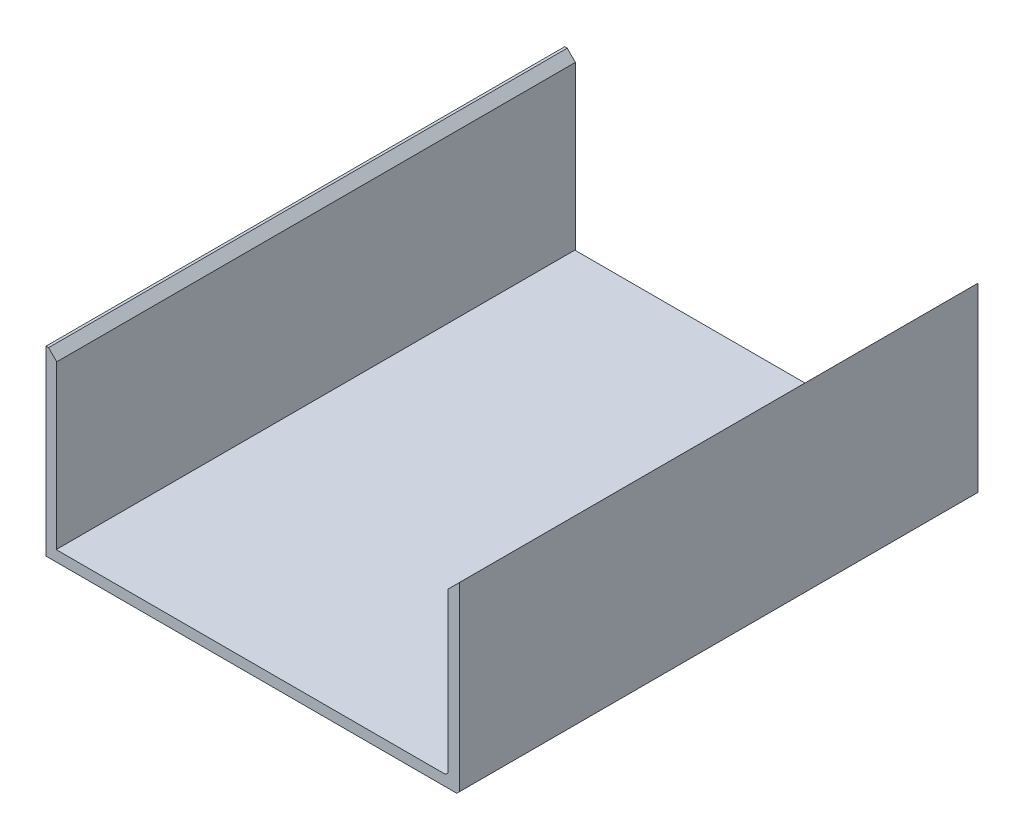
ISO-10303-21;
HEADER;
FILE_DESCRIPTION(('STEP AP214'),'2;1');
FILE_NAME('part.step','',(''),(''),'','','');
FILE_SCHEMA(('AUTOMOTIVE_DESIGN { 1 0 10303 214 1 1 1 1 }'));
ENDSEC;
DATA;
#1=APPLICATION_CONTEXT('core data for automotive mechanical design processes');
#2=APPLICATION_PROTOCOL_DEFINITION('international standard','automotive_design',2000,#1);
#3=PRODUCT_CONTEXT('',#1,'mechanical');
#4=PRODUCT('Part','Part','',(#3));
#5=PRODUCT_RELATED_PRODUCT_CATEGORY('part','',(#4));
#6=PRODUCT_DEFINITION_FORMATION('','',#4);
#7=PRODUCT_DEFINITION_CONTEXT('part definition',#1,'design');
#8=PRODUCT_DEFINITION('design','',#6,#7);
#9=PRODUCT_DEFINITION_SHAPE('','',#8);
#10=(LENGTH_UNIT() NAMED_UNIT(*) SI_UNIT(.MILLI.,.METRE.));
#11=(NAMED_UNIT(*) PLANE_ANGLE_UNIT() SI_UNIT($,.RADIAN.));
#12=(NAMED_UNIT(*) SI_UNIT($,.STERADIAN.) SOLID_ANGLE_UNIT());
#13=UNCERTAINTY_MEASURE_WITH_UNIT(LENGTH_MEASURE(1.E-05),#10,'distance_accuracy_value','');
#14=(GEOMETRIC_REPRESENTATION_CONTEXT(3) GLOBAL_UNCERTAINTY_ASSIGNED_CONTEXT((#13)) GLOBAL_UNIT_ASSIGNED_CONTEXT((#10,
#11,#12)) REPRESENTATION_CONTEXT('',''));
#15=CARTESIAN_POINT('',(0.,0.,0.));
#16=DIRECTION('',(0.,0.,1.));
#17=DIRECTION('',(1.,0.,0.));
#18=AXIS2_PLACEMENT_3D('',#15,#16,#17);
#19=CARTESIAN_POINT('',(-3.8958012,1.72306488,0.));
#20=DIRECTION('',(0.,-1.,0.));
#21=DIRECTION('',(0.,0.,-1.));
#22=AXIS2_PLACEMENT_3D('',#19,#20,#21);
#23=PLANE('',#22);
#24=DIRECTION('',(0.,0.,1.));
#25=VECTOR('',#24,1.);
#26=CARTESIAN_POINT('',(-3.94454888,1.72306488,0.));
#27=LINE('',#26,#25);
#28=CARTESIAN_POINT('',(-3.94454888,1.72306488,0.));
#29=VERTEX_POINT('',#28);
#30=CARTESIAN_POINT('',(-3.94454888,1.72306488,9.90000052));
#31=VERTEX_POINT('',#30);
#32=EDGE_CURVE('E123',#29,#31,#27,.T.);
#33=ORIENTED_EDGE('',*,*,#32,.T.);
#34=DIRECTION('',(1.,0.,0.));
#35=VECTOR('',#34,1.);
#36=CARTESIAN_POINT('',(-3.8958012,1.72306488,9.90000052));
#37=LINE('',#36,#35);
#38=CARTESIAN_POINT('',(-3.8958012,1.72306488,9.90000052));
#39=VERTEX_POINT('',#38);
#40=EDGE_CURVE('E108',#39,#31,#37,.F.);
#41=ORIENTED_EDGE('',*,*,#40,.F.);
#42=DIRECTION('',(0.,0.,1.));
#43=VECTOR('',#42,1.);
#44=CARTESIAN_POINT('',(-3.8958012,1.72306488,0.));
#45=LINE('',#44,#43);
#46=CARTESIAN_POINT('',(-3.8958012,1.72306488,0.));
#47=VERTEX_POINT('',#46);
#48=EDGE_CURVE('E194',#39,#47,#45,.F.);
#49=ORIENTED_EDGE('',*,*,#48,.T.);
#50=DIRECTION('',(1.,0.,0.));
#51=VECTOR('',#50,1.);
#52=CARTESIAN_POINT('',(-3.8958012,1.72306488,0.));
#53=LINE('',#52,#51);
#54=EDGE_CURVE('E120',#29,#47,#53,.T.);
#55=ORIENTED_EDGE('',*,*,#54,.F.);
#56=EDGE_LOOP('',(#33,#41,#49,#55));
#57=FACE_BOUND('',#56,.T.);
#58=ADVANCED_FACE('F17',(#57),#23,.F.);
#59=CARTESIAN_POINT('',(-3.73941848,1.56668216,0.));
#60=DIRECTION('',(-0.707106781186548,-0.707106781186548,0.));
#61=DIRECTION('',(0.707106781186548,-0.707106781186548,0.));
#62=AXIS2_PLACEMENT_3D('',#59,#60,#61);
#63=PLANE('',#62);
#64=ORIENTED_EDGE('',*,*,#48,.F.);
#65=DIRECTION('',(0.707106781186548,-0.707106781186548,0.));
#66=VECTOR('',#65,1.);
#67=CARTESIAN_POINT('',(-3.73941848,1.56668216,9.90000052));
#68=LINE('',#67,#66);
#69=CARTESIAN_POINT('',(-3.73941848,1.56668216,9.90000052));
#70=VERTEX_POINT('',#69);
#71=EDGE_CURVE('E116',#70,#39,#68,.F.);
#72=ORIENTED_EDGE('',*,*,#71,.F.);
#73=DIRECTION('',(0.,0.,1.));
#74=VECTOR('',#73,1.);
#75=CARTESIAN_POINT('',(-3.73941848,1.56668216,0.));
#76=LINE('',#75,#74);
#77=CARTESIAN_POINT('',(-3.73941848,1.56668216,0.));
#78=VERTEX_POINT('',#77);
#79=EDGE_CURVE('E166',#70,#78,#76,.F.);
#80=ORIENTED_EDGE('',*,*,#79,.T.);
#81=DIRECTION('',(0.707106781186548,-0.707106781186548,0.));
#82=VECTOR('',#81,1.);
#83=CARTESIAN_POINT('',(-3.73941848,1.56668216,0.));
#84=LINE('',#83,#82);
#85=EDGE_CURVE('E187',#47,#78,#84,.T.);
#86=ORIENTED_EDGE('',*,*,#85,.F.);
#87=EDGE_LOOP('',(#64,#72,#80,#86));
#88=FACE_BOUND('',#87,.T.);
#89=ADVANCED_FACE('F204',(#88),#63,.F.);
#90=CARTESIAN_POINT('',(-3.750691,-1.54263852,0.));
#91=DIRECTION('',(-0.707106781186048,0.707106781187048,0.));
#92=DIRECTION('',(-0.707106781187048,-0.707106781186048,0.));
#93=AXIS2_PLACEMENT_3D('',#90,#91,#92);
#94=PLANE('',#93);
#95=DIRECTION('',(0.,0.,1.));
#96=VECTOR('',#95,1.);
#97=CARTESIAN_POINT('',(-3.73941848,-1.531366,0.));
#98=LINE('',#97,#96);
#99=CARTESIAN_POINT('',(-3.73941848,-1.531366,0.));
#100=VERTEX_POINT('',#99);
#101=CARTESIAN_POINT('',(-3.73941848,-1.531366,9.90000052));
#102=VERTEX_POINT('',#101);
#103=EDGE_CURVE('E127',#100,#102,#98,.T.);
#104=ORIENTED_EDGE('',*,*,#103,.T.);
#105=DIRECTION('',(-0.707106781187048,-0.707106781186048,0.));
#106=VECTOR('',#105,1.);
#107=CARTESIAN_POINT('',(-3.750691,-1.54263852,9.90000052));
#108=LINE('',#107,#106);
#109=CARTESIAN_POINT('',(-3.750691,-1.54263852,9.90000052));
#110=VERTEX_POINT('',#109);
#111=EDGE_CURVE('E185',#110,#102,#108,.F.);
#112=ORIENTED_EDGE('',*,*,#111,.F.);
#113=DIRECTION('',(0.,0.,-1.));
#114=VECTOR('',#113,1.);
#115=CARTESIAN_POINT('',(-3.750691,-1.54263852,0.));
#116=LINE('',#115,#114);
#117=CARTESIAN_POINT('',(-3.750691,-1.54263852,0.));
#118=VERTEX_POINT('',#117);
#119=EDGE_CURVE('E160',#110,#118,#116,.T.);
#120=ORIENTED_EDGE('',*,*,#119,.T.);
#121=DIRECTION('',(-0.707106781187048,-0.707106781186048,0.));
#122=VECTOR('',#121,1.);
#123=CARTESIAN_POINT('',(-3.750691,-1.54263852,0.));
#124=LINE('',#123,#122);
#125=EDGE_CURVE('E183',#100,#118,#124,.T.);
#126=ORIENTED_EDGE('',*,*,#125,.F.);
#127=EDGE_LOOP('',(#104,#112,#120,#126));
#128=FACE_BOUND('',#127,.T.);
#129=ADVANCED_FACE('F372',(#128),#94,.F.);
#130=CARTESIAN_POINT('',(3.72744492,-1.49495764,0.));
#131=DIRECTION('',(0.707106781186548,-0.707106781186548,0.));
#132=DIRECTION('',(0.707106781186548,0.707106781186548,0.));
#133=AXIS2_PLACEMENT_3D('',#130,#131,#132);
#134=PLANE('',#133);
#135=DIRECTION('',(0.,0.,-1.));
#136=VECTOR('',#135,1.);
#137=CARTESIAN_POINT('',(3.67976404,-1.54263852,0.));
#138=LINE('',#137,#136);
#139=CARTESIAN_POINT('',(3.67976404,-1.54263852,0.));
#140=VERTEX_POINT('',#139);
#141=CARTESIAN_POINT('',(3.67976404,-1.54263852,9.90000052));
#142=VERTEX_POINT('',#141);
#143=EDGE_CURVE('E163',#140,#142,#138,.F.);
#144=ORIENTED_EDGE('',*,*,#143,.T.);
#145=DIRECTION('',(0.707106781186548,0.707106781186548,0.));
#146=VECTOR('',#145,1.);
#147=CARTESIAN_POINT('',(3.72744492,-1.49495764,9.90000052));
#148=LINE('',#147,#146);
#149=CARTESIAN_POINT('',(3.72744492,-1.49495764,9.90000052));
#150=VERTEX_POINT('',#149);
#151=EDGE_CURVE('E181',#150,#142,#148,.F.);
#152=ORIENTED_EDGE('',*,*,#151,.F.);
#153=DIRECTION('',(0.,0.,-1.));
#154=VECTOR('',#153,1.);
#155=CARTESIAN_POINT('',(3.72744492,-1.49495764,0.));
#156=LINE('',#155,#154);
#157=CARTESIAN_POINT('',(3.72744492,-1.49495764,0.));
#158=VERTEX_POINT('',#157);
#159=EDGE_CURVE('E154',#150,#158,#156,.T.);
#160=ORIENTED_EDGE('',*,*,#159,.T.);
#161=DIRECTION('',(0.707106781186548,0.707106781186548,0.));
#162=VECTOR('',#161,1.);
#163=CARTESIAN_POINT('',(3.72744492,-1.49495764,0.));
#164=LINE('',#163,#162);
#165=EDGE_CURVE('E179',#140,#158,#164,.T.);
#166=ORIENTED_EDGE('',*,*,#165,.F.);
#167=EDGE_LOOP('',(#144,#152,#160,#166));
#168=FACE_BOUND('',#167,.T.);
#169=ADVANCED_FACE('F245',(#168),#134,.F.);
#170=CARTESIAN_POINT('',(3.94458952,1.75979836,0.));
#171=DIRECTION('',(0.707106781186548,-0.707106781186548,0.));
#172=DIRECTION('',(0.707106781186548,0.707106781186548,0.));
#173=AXIS2_PLACEMENT_3D('',#170,#171,#172);
#174=PLANE('',#173);
#175=DIRECTION('',(0.,0.,-1.));
#176=VECTOR('',#175,1.);
#177=CARTESIAN_POINT('',(3.72744492,1.54265376,0.));
#178=LINE('',#177,#176);
#179=CARTESIAN_POINT('',(3.72744492,1.54265376,0.));
#180=VERTEX_POINT('',#179);
#181=CARTESIAN_POINT('',(3.72744492,1.54265376,9.90000052));
#182=VERTEX_POINT('',#181);
#183=EDGE_CURVE('E157',#180,#182,#178,.F.);
#184=ORIENTED_EDGE('',*,*,#183,.T.);
#185=DIRECTION('',(0.707106781186548,0.707106781186548,0.));
#186=VECTOR('',#185,1.);
#187=CARTESIAN_POINT('',(3.94458952,1.75979836,9.90000052));
#188=LINE('',#187,#186);
#189=CARTESIAN_POINT('',(3.94458952,1.75979836,9.90000052));
#190=VERTEX_POINT('',#189);
#191=EDGE_CURVE('E177',#190,#182,#188,.F.);
#192=ORIENTED_EDGE('',*,*,#191,.F.);
#193=DIRECTION('',(0.,0.,1.));
#194=VECTOR('',#193,1.);
#195=CARTESIAN_POINT('',(3.94458952,1.75979836,0.));
#196=LINE('',#195,#194);
#197=CARTESIAN_POINT('',(3.94458952,1.75979836,0.));
#198=VERTEX_POINT('',#197);
#199=EDGE_CURVE('E138',#190,#198,#196,.F.);
#200=ORIENTED_EDGE('',*,*,#199,.T.);
#201=DIRECTION('',(0.707106781186548,0.707106781186548,0.));
#202=VECTOR('',#201,1.);
#203=CARTESIAN_POINT('',(3.94458952,1.75979836,0.));
#204=LINE('',#203,#202);
#205=EDGE_CURVE('E128',#180,#198,#204,.T.);
#206=ORIENTED_EDGE('',*,*,#205,.F.);
#207=EDGE_LOOP('',(#184,#192,#200,#206));
#208=FACE_BOUND('',#207,.T.);
#209=ADVANCED_FACE('F356',(#208),#174,.F.);
#210=CARTESIAN_POINT('',(-3.94454888,1.72306488,0.));
#211=DIRECTION('',(0.999999989362867,0.000145857003157181,0.));
#212=DIRECTION('',(-0.000145857003157181,0.999999989362867,0.));
#213=AXIS2_PLACEMENT_3D('',#210,#211,#212);
#214=PLANE('',#213);
#215=DIRECTION('',(0.,0.,1.));
#216=VECTOR('',#215,1.);
#217=CARTESIAN_POINT('',(-3.9440408555521,-1.7599659755521,0.));
#218=LINE('',#217,#216);
#219=CARTESIAN_POINT('',(-3.94388783860097,-1.7596287917726,0.));
#220=VERTEX_POINT('',#219);
#221=CARTESIAN_POINT('',(-3.94388783860097,-1.7596287917726,9.90000052));
#222=VERTEX_POINT('',#221);
#223=EDGE_CURVE('E131',#220,#222,#218,.T.);
#224=ORIENTED_EDGE('',*,*,#223,.T.);
#225=DIRECTION('',(-0.000145857003030727,0.999999989362867,0.));
#226=VECTOR('',#225,1.);
#227=CARTESIAN_POINT('',(-3.944040926846,-1.759477185454,9.90000052));
#228=LINE('',#227,#226);
#229=EDGE_CURVE('E113',#222,#31,#228,.T.);
#230=ORIENTED_EDGE('',*,*,#229,.T.);
#231=ORIENTED_EDGE('',*,*,#32,.F.);
#232=DIRECTION('',(-0.000145857003030727,0.999999989362867,0.));
#233=VECTOR('',#232,1.);
#234=CARTESIAN_POINT('',(-3.944040926846,-1.759477185454,0.));
#235=LINE('',#234,#233);
#236=EDGE_CURVE('E211',#220,#29,#235,.T.);
#237=ORIENTED_EDGE('',*,*,#236,.F.);
#238=EDGE_LOOP('',(#224,#230,#231,#237));
#239=FACE_BOUND('',#238,.T.);
#240=ADVANCED_FACE('F130',(#239),#214,.F.);
#241=CARTESIAN_POINT('',(-3.73941848,-1.531366,0.));
#242=DIRECTION('',(-1.,0.,0.));
#243=DIRECTION('',(0.,0.,1.));
#244=AXIS2_PLACEMENT_3D('',#241,#242,#243);
#245=PLANE('',#244);
#246=ORIENTED_EDGE('',*,*,#79,.F.);
#247=DIRECTION('',(0.,1.,0.));
#248=VECTOR('',#247,1.);
#249=CARTESIAN_POINT('',(-3.73941848,1.75979836,9.90000052));
#250=LINE('',#249,#248);
#251=EDGE_CURVE('E133',#70,#102,#250,.F.);
#252=ORIENTED_EDGE('',*,*,#251,.T.);
#253=ORIENTED_EDGE('',*,*,#103,.F.);
#254=DIRECTION('',(0.,1.,0.));
#255=VECTOR('',#254,1.);
#256=CARTESIAN_POINT('',(-3.73941848,1.75979836,0.));
#257=LINE('',#256,#255);
#258=EDGE_CURVE('E209',#78,#100,#257,.F.);
#259=ORIENTED_EDGE('',*,*,#258,.F.);
#260=EDGE_LOOP('',(#246,#252,#253,#259));
#261=FACE_BOUND('',#260,.T.);
#262=ADVANCED_FACE('F340',(#261),#245,.F.);
#263=CARTESIAN_POINT('',(3.67976404,-1.54263852,0.));
#264=DIRECTION('',(0.,-1.,0.));
#265=DIRECTION('',(0.,0.,-1.));
#266=AXIS2_PLACEMENT_3D('',#263,#264,#265);
#267=PLANE('',#266);
#268=ORIENTED_EDGE('',*,*,#119,.F.);
#269=DIRECTION('',(-1.,0.,0.));
#270=VECTOR('',#269,1.);
#271=CARTESIAN_POINT('',(3.94458952,-1.54263852,9.90000052));
#272=LINE('',#271,#270);
#273=EDGE_CURVE('E136',#110,#142,#272,.F.);
#274=ORIENTED_EDGE('',*,*,#273,.T.);
#275=ORIENTED_EDGE('',*,*,#143,.F.);
#276=DIRECTION('',(-1.,0.,0.));
#277=VECTOR('',#276,1.);
#278=CARTESIAN_POINT('',(3.94458952,-1.54263852,0.));
#279=LINE('',#278,#277);
#280=EDGE_CURVE('E215',#118,#140,#279,.F.);
#281=ORIENTED_EDGE('',*,*,#280,.F.);
#282=EDGE_LOOP('',(#268,#274,#275,#281));
#283=FACE_BOUND('',#282,.T.);
#284=ADVANCED_FACE('F239',(#283),#267,.F.);
#285=CARTESIAN_POINT('',(3.72744492,1.54265376,0.));
#286=DIRECTION('',(1.,0.,0.));
#287=DIRECTION('',(0.,0.,-1.));
#288=AXIS2_PLACEMENT_3D('',#285,#286,#287);
#289=PLANE('',#288);
#290=ORIENTED_EDGE('',*,*,#159,.F.);
#291=DIRECTION('',(0.,1.,0.));
#292=VECTOR('',#291,1.);
#293=CARTESIAN_POINT('',(3.72744492,1.75979836,9.90000052));
#294=LINE('',#293,#292);
#295=EDGE_CURVE('E232',#150,#182,#294,.T.);
#296=ORIENTED_EDGE('',*,*,#295,.T.);
#297=ORIENTED_EDGE('',*,*,#183,.F.);
#298=DIRECTION('',(0.,1.,0.));
#299=VECTOR('',#298,1.);
#300=CARTESIAN_POINT('',(3.72744492,1.75979836,0.));
#301=LINE('',#300,#299);
#302=EDGE_CURVE('E248',#158,#180,#301,.T.);
#303=ORIENTED_EDGE('',*,*,#302,.F.);
#304=EDGE_LOOP('',(#290,#296,#297,#303));
#305=FACE_BOUND('',#304,.T.);
#306=ADVANCED_FACE('F277',(#305),#289,.F.);
#307=CARTESIAN_POINT('',(3.94458952,-1.6994632,0.));
#308=DIRECTION('',(-1.,0.,0.));
#309=DIRECTION('',(0.,0.,1.));
#310=AXIS2_PLACEMENT_3D('',#307,#308,#309);
#311=PLANE('',#310);
#312=ORIENTED_EDGE('',*,*,#199,.F.);
#313=DIRECTION('',(0.,1.,0.));
#314=VECTOR('',#313,1.);
#315=CARTESIAN_POINT('',(3.94458952,1.75979836,9.90000052));
#316=LINE('',#315,#314);
#317=CARTESIAN_POINT('',(3.94458952,-1.6994632,9.90000052));
#318=VERTEX_POINT('',#317);
#319=EDGE_CURVE('E228',#190,#318,#316,.F.);
#320=ORIENTED_EDGE('',*,*,#319,.T.);
#321=DIRECTION('',(0.,0.,1.));
#322=VECTOR('',#321,1.);
#323=CARTESIAN_POINT('',(3.94458952,-1.6994632,0.));
#324=LINE('',#323,#322);
#325=CARTESIAN_POINT('',(3.94458952,-1.6994632,0.));
#326=VERTEX_POINT('',#325);
#327=EDGE_CURVE('E213',#318,#326,#324,.F.);
#328=ORIENTED_EDGE('',*,*,#327,.T.);
#329=DIRECTION('',(0.,1.,0.));
#330=VECTOR('',#329,1.);
#331=CARTESIAN_POINT('',(3.94458952,1.75979836,0.));
#332=LINE('',#331,#330);
#333=EDGE_CURVE('E249',#198,#326,#332,.F.);
#334=ORIENTED_EDGE('',*,*,#333,.F.);
#335=EDGE_LOOP('',(#312,#320,#328,#334));
#336=FACE_BOUND('',#335,.T.);
#337=ADVANCED_FACE('F269',(#336),#311,.F.);
#338=CARTESIAN_POINT('',(-3.94368274,-1.75960786,0.));
#339=DIRECTION('',(-0.707106781187048,0.707106781186048,0.));
#340=DIRECTION('',(-0.707106781186048,-0.707106781187048,0.));
#341=AXIS2_PLACEMENT_3D('',#338,#339,#340);
#342=PLANE('',#341);
#343=DIRECTION('',(0.,0.,1.));
#344=VECTOR('',#343,1.);
#345=CARTESIAN_POINT('',(-3.9318438,-1.74776892,0.));
#346=LINE('',#345,#344);
#347=CARTESIAN_POINT('',(-3.9318438,-1.74776892,0.));
#348=VERTEX_POINT('',#347);
#349=CARTESIAN_POINT('',(-3.9318438,-1.74776892,9.90000052));
#350=VERTEX_POINT('',#349);
#351=EDGE_CURVE('E143',#348,#350,#346,.T.);
#352=ORIENTED_EDGE('',*,*,#351,.T.);
#353=DIRECTION('',(-0.707106781186496,-0.707106781186599,0.));
#354=VECTOR('',#353,1.);
#355=CARTESIAN_POINT('',(-3.9318438,-1.74776892,9.90000052));
#356=LINE('',#355,#354);
#357=EDGE_CURVE('E226',#350,#222,#356,.T.);
#358=ORIENTED_EDGE('',*,*,#357,.T.);
#359=ORIENTED_EDGE('',*,*,#223,.F.);
#360=DIRECTION('',(-0.707106781186496,-0.707106781186599,0.));
#361=VECTOR('',#360,1.);
#362=CARTESIAN_POINT('',(-3.9318438,-1.74776892,0.));
#363=LINE('',#362,#361);
#364=EDGE_CURVE('E147',#348,#220,#363,.T.);
#365=ORIENTED_EDGE('',*,*,#364,.F.);
#366=EDGE_LOOP('',(#352,#358,#359,#365));
#367=FACE_BOUND('',#366,.T.);
#368=ADVANCED_FACE('F267',(#367),#342,.F.);
#369=CARTESIAN_POINT('',(3.94458952,1.75979836,9.90000052));
#370=DIRECTION('',(0.,0.,-1.));
#371=DIRECTION('',(-1.,0.,0.));
#372=AXIS2_PLACEMENT_3D('',#369,#370,#371);
#373=PLANE('',#372);
#374=DIRECTION('',(1.,0.,0.));
#375=VECTOR('',#374,1.);
#376=CARTESIAN_POINT('',(-3.9318438,-1.74776892,9.90000052));
#377=LINE('',#376,#375);
#378=CARTESIAN_POINT('',(3.8962838,-1.74776892,9.90000052));
#379=VERTEX_POINT('',#378);
#380=EDGE_CURVE('E146',#350,#379,#377,.T.);
#381=ORIENTED_EDGE('',*,*,#380,.T.);
#382=DIRECTION('',(-0.707106781186548,-0.707106781186548,0.));
#383=VECTOR('',#382,1.);
#384=CARTESIAN_POINT('',(3.8962838,-1.74776892,9.90000052));
#385=LINE('',#384,#383);
#386=EDGE_CURVE('E218',#379,#318,#385,.F.);
#387=ORIENTED_EDGE('',*,*,#386,.T.);
#388=ORIENTED_EDGE('',*,*,#319,.F.);
#389=ORIENTED_EDGE('',*,*,#191,.T.);
#390=ORIENTED_EDGE('',*,*,#295,.F.);
#391=ORIENTED_EDGE('',*,*,#151,.T.);
#392=ORIENTED_EDGE('',*,*,#273,.F.);
#393=ORIENTED_EDGE('',*,*,#111,.T.);
#394=ORIENTED_EDGE('',*,*,#251,.F.);
#395=ORIENTED_EDGE('',*,*,#71,.T.);
#396=ORIENTED_EDGE('',*,*,#40,.T.);
#397=ORIENTED_EDGE('',*,*,#229,.F.);
#398=ORIENTED_EDGE('',*,*,#357,.F.);
#399=EDGE_LOOP('',(#381,#387,#388,#389,#390,#391,#392,#393,#394,#395,#396,#397,#398));
#400=FACE_BOUND('',#399,.T.);
#401=ADVANCED_FACE('F111',(#400),#373,.F.);
#402=CARTESIAN_POINT('',(3.8962838,-1.74776892,0.));
#403=DIRECTION('',(-0.707106781186548,0.707106781186548,0.));
#404=DIRECTION('',(-0.707106781186548,-0.707106781186548,0.));
#405=AXIS2_PLACEMENT_3D('',#402,#403,#404);
#406=PLANE('',#405);
#407=ORIENTED_EDGE('',*,*,#327,.F.);
#408=ORIENTED_EDGE('',*,*,#386,.F.);
#409=DIRECTION('',(0.,0.,1.));
#410=VECTOR('',#409,1.);
#411=CARTESIAN_POINT('',(3.8962838,-1.74776892,0.));
#412=LINE('',#411,#410);
#413=CARTESIAN_POINT('',(3.8962838,-1.74776892,0.));
#414=VERTEX_POINT('',#413);
#415=EDGE_CURVE('E26',#379,#414,#412,.F.);
#416=ORIENTED_EDGE('',*,*,#415,.T.);
#417=DIRECTION('',(-0.707106781186544,-0.707106781186551,0.));
#418=VECTOR('',#417,1.);
#419=CARTESIAN_POINT('',(3.94458952,-1.6994632,0.));
#420=LINE('',#419,#418);
#421=EDGE_CURVE('E34',#326,#414,#420,.T.);
#422=ORIENTED_EDGE('',*,*,#421,.F.);
#423=EDGE_LOOP('',(#407,#408,#416,#422));
#424=FACE_BOUND('',#423,.T.);
#425=ADVANCED_FACE('F261',(#424),#406,.F.);
#426=CARTESIAN_POINT('',(3.94458952,1.75979836,0.));
#427=DIRECTION('',(0.,0.,-1.));
#428=DIRECTION('',(-1.,0.,0.));
#429=AXIS2_PLACEMENT_3D('',#426,#427,#428);
#430=PLANE('',#429);
#431=DIRECTION('',(1.,0.,0.));
#432=VECTOR('',#431,1.);
#433=CARTESIAN_POINT('',(-3.9318438,-1.74776892,0.));
#434=LINE('',#433,#432);
#435=EDGE_CURVE('E11',#414,#348,#434,.F.);
#436=ORIENTED_EDGE('',*,*,#435,.T.);
#437=ORIENTED_EDGE('',*,*,#364,.T.);
#438=ORIENTED_EDGE('',*,*,#236,.T.);
#439=ORIENTED_EDGE('',*,*,#54,.T.);
#440=ORIENTED_EDGE('',*,*,#85,.T.);
#441=ORIENTED_EDGE('',*,*,#258,.T.);
#442=ORIENTED_EDGE('',*,*,#125,.T.);
#443=ORIENTED_EDGE('',*,*,#280,.T.);
#444=ORIENTED_EDGE('',*,*,#165,.T.);
#445=ORIENTED_EDGE('',*,*,#302,.T.);
#446=ORIENTED_EDGE('',*,*,#205,.T.);
#447=ORIENTED_EDGE('',*,*,#333,.T.);
#448=ORIENTED_EDGE('',*,*,#421,.T.);
#449=EDGE_LOOP('',(#436,#437,#438,#439,#440,#441,#442,#443,#444,#445,#446,#447,#448));
#450=FACE_BOUND('',#449,.T.);
#451=ADVANCED_FACE('F208',(#450),#430,.T.);
#452=CARTESIAN_POINT('',(-3.9318438,-1.74776892,0.));
#453=DIRECTION('',(0.,1.,0.));
#454=DIRECTION('',(0.,0.,1.));
#455=AXIS2_PLACEMENT_3D('',#452,#453,#454);
#456=PLANE('',#455);
#457=ORIENTED_EDGE('',*,*,#415,.F.);
#458=ORIENTED_EDGE('',*,*,#380,.F.);
#459=ORIENTED_EDGE('',*,*,#351,.F.);
#460=ORIENTED_EDGE('',*,*,#435,.F.);
#461=EDGE_LOOP('',(#457,#458,#459,#460));
#462=FACE_BOUND('',#461,.T.);
#463=ADVANCED_FACE('F264',(#462),#456,.F.);
#464=CLOSED_SHELL('',(#58,#89,#129,#169,#209,#240,#262,#284,#306,#337,#368,#401,#425,#451,#463));
#465=MANIFOLD_SOLID_BREP('B1',#464);
#466=ADVANCED_BREP_SHAPE_REPRESENTATION('',(#18,#465),#14);
#467=SHAPE_DEFINITION_REPRESENTATION(#9,#466);
ENDSEC;
END-ISO-10303-21;
